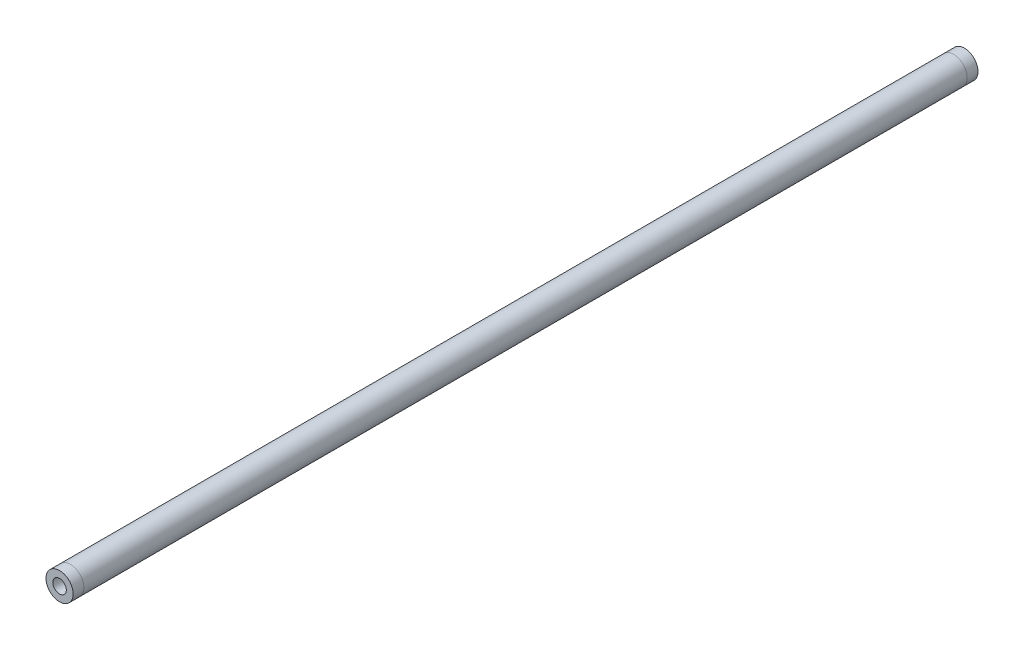
ISO-10303-21;
HEADER;
FILE_DESCRIPTION(('STEP AP214'),'2;1');
FILE_NAME('part.step','',(''),(''),'','','');
FILE_SCHEMA(('AUTOMOTIVE_DESIGN { 1 0 10303 214 1 1 1 1 }'));
ENDSEC;
DATA;
#1=APPLICATION_CONTEXT('core data for automotive mechanical design processes');
#2=APPLICATION_PROTOCOL_DEFINITION('international standard','automotive_design',2000,#1);
#3=PRODUCT_CONTEXT('',#1,'mechanical');
#4=PRODUCT('Part','Part','',(#3));
#5=PRODUCT_RELATED_PRODUCT_CATEGORY('part','',(#4));
#6=PRODUCT_DEFINITION_FORMATION('','',#4);
#7=PRODUCT_DEFINITION_CONTEXT('part definition',#1,'design');
#8=PRODUCT_DEFINITION('design','',#6,#7);
#9=PRODUCT_DEFINITION_SHAPE('','',#8);
#10=(LENGTH_UNIT() NAMED_UNIT(*) SI_UNIT(.MILLI.,.METRE.));
#11=(NAMED_UNIT(*) PLANE_ANGLE_UNIT() SI_UNIT($,.RADIAN.));
#12=(NAMED_UNIT(*) SI_UNIT($,.STERADIAN.) SOLID_ANGLE_UNIT());
#13=UNCERTAINTY_MEASURE_WITH_UNIT(LENGTH_MEASURE(1.E-05),#10,'distance_accuracy_value','');
#14=(GEOMETRIC_REPRESENTATION_CONTEXT(3) GLOBAL_UNCERTAINTY_ASSIGNED_CONTEXT((#13)) GLOBAL_UNIT_ASSIGNED_CONTEXT((#10,
#11,#12)) REPRESENTATION_CONTEXT('',''));
#15=CARTESIAN_POINT('',(0.,0.,0.));
#16=DIRECTION('',(0.,0.,1.));
#17=DIRECTION('',(1.,0.,0.));
#18=AXIS2_PLACEMENT_3D('',#15,#16,#17);
#19=CARTESIAN_POINT('',(0.,0.,-533.036266284947));
#20=DIRECTION('',(0.,0.,1.));
#21=DIRECTION('',(1.,0.,0.));
#22=AXIS2_PLACEMENT_3D('',#19,#20,#21);
#23=CYLINDRICAL_SURFACE('',#22,8.001);
#24=CARTESIAN_POINT('',(0.,0.,-533.036266284947));
#25=DIRECTION('',(0.,0.,1.));
#26=DIRECTION('',(1.,0.,0.));
#27=AXIS2_PLACEMENT_3D('',#24,#25,#26);
#28=CIRCLE('',#27,8.001);
#29=CARTESIAN_POINT('',(8.001,0.,-533.036266284947));
#30=VERTEX_POINT('',#29);
#31=EDGE_CURVE('E87',#30,#30,#28,.T.);
#32=ORIENTED_EDGE('',*,*,#31,.T.);
#33=EDGE_LOOP('',(#32));
#34=FACE_BOUND('',#33,.T.);
#35=CARTESIAN_POINT('',(0.,0.,-526.686266284947));
#36=DIRECTION('',(0.,0.,1.));
#37=DIRECTION('',(1.,0.,0.));
#38=AXIS2_PLACEMENT_3D('',#35,#36,#37);
#39=CIRCLE('',#38,8.001);
#40=CARTESIAN_POINT('',(8.001,0.,-526.686266284947));
#41=VERTEX_POINT('',#40);
#42=EDGE_CURVE('E83',#41,#41,#39,.T.);
#43=ORIENTED_EDGE('',*,*,#42,.F.);
#44=EDGE_LOOP('',(#43));
#45=FACE_BOUND('',#44,.T.);
#46=ADVANCED_FACE('F80',(#34,#45),#23,.T.);
#47=CARTESIAN_POINT('',(0.,0.,-533.036266284947));
#48=DIRECTION('',(0.,0.,1.));
#49=DIRECTION('',(1.,0.,0.));
#50=AXIS2_PLACEMENT_3D('',#47,#48,#49);
#51=PLANE('',#50);
#52=CARTESIAN_POINT('',(0.,0.,-533.036266284947));
#53=DIRECTION('',(0.,0.,1.));
#54=DIRECTION('',(1.,0.,0.));
#55=AXIS2_PLACEMENT_3D('',#52,#53,#54);
#56=CIRCLE('',#55,3.96875);
#57=CARTESIAN_POINT('',(3.96875,0.,-533.036266284947));
#58=VERTEX_POINT('',#57);
#59=EDGE_CURVE('E96',#58,#58,#56,.T.);
#60=ORIENTED_EDGE('',*,*,#59,.T.);
#61=EDGE_LOOP('',(#60));
#62=FACE_BOUND('',#61,.T.);
#63=ORIENTED_EDGE('',*,*,#31,.F.);
#64=EDGE_LOOP('',(#63));
#65=FACE_BOUND('',#64,.T.);
#66=ADVANCED_FACE('F123',(#62,#65),#51,.F.);
#67=CARTESIAN_POINT('',(0.,0.,-526.686266284947));
#68=DIRECTION('',(0.,0.,1.));
#69=DIRECTION('',(1.,0.,0.));
#70=AXIS2_PLACEMENT_3D('',#67,#68,#69);
#71=PLANE('',#70);
#72=CARTESIAN_POINT('',(0.,0.,-526.686266284947));
#73=DIRECTION('',(0.,0.,1.));
#74=DIRECTION('',(1.,0.,0.));
#75=AXIS2_PLACEMENT_3D('',#72,#73,#74);
#76=CIRCLE('',#75,6.477);
#77=CARTESIAN_POINT('',(-6.477,0.,-526.686266284947));
#78=VERTEX_POINT('',#77);
#79=EDGE_CURVE('E12',#78,#78,#76,.T.);
#80=ORIENTED_EDGE('',*,*,#79,.F.);
#81=EDGE_LOOP('',(#80));
#82=FACE_BOUND('',#81,.T.);
#83=ORIENTED_EDGE('',*,*,#42,.T.);
#84=EDGE_LOOP('',(#83));
#85=FACE_BOUND('',#84,.T.);
#86=ADVANCED_FACE('F119',(#82,#85),#71,.T.);
#87=CARTESIAN_POINT('',(0.,0.,-533.036266284947));
#88=DIRECTION('',(0.,0.,1.));
#89=DIRECTION('',(1.,0.,0.));
#90=AXIS2_PLACEMENT_3D('',#87,#88,#89);
#91=CYLINDRICAL_SURFACE('',#90,3.96875);
#92=ORIENTED_EDGE('',*,*,#59,.F.);
#93=EDGE_LOOP('',(#92));
#94=FACE_BOUND('',#93,.T.);
#95=CARTESIAN_POINT('',(0.,0.,-517.161266284947));
#96=DIRECTION('',(0.,0.,1.));
#97=DIRECTION('',(1.,0.,0.));
#98=AXIS2_PLACEMENT_3D('',#95,#96,#97);
#99=CIRCLE('',#98,3.96875);
#100=CARTESIAN_POINT('',(3.96875,0.,-517.161266284947));
#101=VERTEX_POINT('',#100);
#102=EDGE_CURVE('E102',#101,#101,#99,.T.);
#103=ORIENTED_EDGE('',*,*,#102,.T.);
#104=EDGE_LOOP('',(#103));
#105=FACE_BOUND('',#104,.T.);
#106=ADVANCED_FACE('F108',(#94,#105),#91,.F.);
#107=CARTESIAN_POINT('',(0.,0.,-517.161266284947));
#108=DIRECTION('',(0.,0.,1.));
#109=DIRECTION('',(1.,0.,0.));
#110=AXIS2_PLACEMENT_3D('',#107,#108,#109);
#111=PLANE('',#110);
#112=CARTESIAN_POINT('',(0.,0.,-517.161266284947));
#113=DIRECTION('',(0.,0.,1.));
#114=DIRECTION('',(1.,0.,0.));
#115=AXIS2_PLACEMENT_3D('',#112,#113,#114);
#116=CIRCLE('',#115,6.477);
#117=CARTESIAN_POINT('',(-6.477,0.,-517.161266284947));
#118=VERTEX_POINT('',#117);
#119=EDGE_CURVE('E94',#118,#118,#116,.T.);
#120=ORIENTED_EDGE('',*,*,#119,.T.);
#121=EDGE_LOOP('',(#120));
#122=FACE_BOUND('',#121,.T.);
#123=ORIENTED_EDGE('',*,*,#102,.F.);
#124=EDGE_LOOP('',(#123));
#125=FACE_BOUND('',#124,.T.);
#126=ADVANCED_FACE('F110',(#122,#125),#111,.T.);
#127=CARTESIAN_POINT('',(0.,0.,-517.161266284947));
#128=DIRECTION('',(0.,0.,-1.));
#129=DIRECTION('',(-1.,0.,0.));
#130=AXIS2_PLACEMENT_3D('',#127,#128,#129);
#131=CYLINDRICAL_SURFACE('',#130,6.477);
#132=CARTESIAN_POINT('',(-6.477,0.,-517.161266284947));
#133=CARTESIAN_POINT('',(-6.477,0.,-517.260485034947));
#134=CARTESIAN_POINT('',(-6.477,0.,-517.359703784947));
#135=CARTESIAN_POINT('',(-6.477,0.,-517.558141284947));
#136=CARTESIAN_POINT('',(-6.477,0.,-517.657360034947));
#137=CARTESIAN_POINT('',(-6.477,0.,-517.855797534947));
#138=CARTESIAN_POINT('',(-6.477,0.,-517.955016284947));
#139=CARTESIAN_POINT('',(-6.477,0.,-518.153453784947));
#140=CARTESIAN_POINT('',(-6.477,0.,-518.252672534947));
#141=CARTESIAN_POINT('',(-6.477,0.,-518.451110034947));
#142=CARTESIAN_POINT('',(-6.477,0.,-518.550328784947));
#143=CARTESIAN_POINT('',(-6.477,0.,-518.748766284947));
#144=CARTESIAN_POINT('',(-6.477,0.,-518.847985034947));
#145=CARTESIAN_POINT('',(-6.477,0.,-519.046422534947));
#146=CARTESIAN_POINT('',(-6.477,0.,-519.145641284947));
#147=CARTESIAN_POINT('',(-6.477,0.,-519.344078784947));
#148=CARTESIAN_POINT('',(-6.477,0.,-519.443297534947));
#149=CARTESIAN_POINT('',(-6.477,0.,-519.641735034947));
#150=CARTESIAN_POINT('',(-6.477,0.,-519.740953784947));
#151=CARTESIAN_POINT('',(-6.477,0.,-519.939391284947));
#152=CARTESIAN_POINT('',(-6.477,0.,-520.038610034947));
#153=CARTESIAN_POINT('',(-6.477,0.,-520.237047534947));
#154=CARTESIAN_POINT('',(-6.477,0.,-520.336266284947));
#155=CARTESIAN_POINT('',(-6.477,0.,-520.534703784947));
#156=CARTESIAN_POINT('',(-6.477,0.,-520.633922534947));
#157=CARTESIAN_POINT('',(-6.477,0.,-520.832360034947));
#158=CARTESIAN_POINT('',(-6.477,0.,-520.931578784947));
#159=CARTESIAN_POINT('',(-6.477,0.,-521.130016284947));
#160=CARTESIAN_POINT('',(-6.477,0.,-521.229235034947));
#161=CARTESIAN_POINT('',(-6.477,0.,-521.427672534947));
#162=CARTESIAN_POINT('',(-6.477,0.,-521.526891284947));
#163=CARTESIAN_POINT('',(-6.477,0.,-521.725328784947));
#164=CARTESIAN_POINT('',(-6.477,0.,-521.824547534947));
#165=CARTESIAN_POINT('',(-6.477,0.,-522.022985034947));
#166=CARTESIAN_POINT('',(-6.477,0.,-522.122203784947));
#167=CARTESIAN_POINT('',(-6.477,0.,-522.320641284947));
#168=CARTESIAN_POINT('',(-6.477,0.,-522.419860034947));
#169=CARTESIAN_POINT('',(-6.477,0.,-522.618297534947));
#170=CARTESIAN_POINT('',(-6.477,0.,-522.717516284947));
#171=CARTESIAN_POINT('',(-6.477,0.,-522.915953784947));
#172=CARTESIAN_POINT('',(-6.477,0.,-523.015172534947));
#173=CARTESIAN_POINT('',(-6.477,0.,-523.213610034947));
#174=CARTESIAN_POINT('',(-6.477,0.,-523.312828784947));
#175=CARTESIAN_POINT('',(-6.477,0.,-523.511266284947));
#176=CARTESIAN_POINT('',(-6.477,0.,-523.610485034947));
#177=CARTESIAN_POINT('',(-6.477,0.,-523.808922534947));
#178=CARTESIAN_POINT('',(-6.477,0.,-523.908141284947));
#179=CARTESIAN_POINT('',(-6.477,0.,-524.106578784947));
#180=CARTESIAN_POINT('',(-6.477,0.,-524.205797534947));
#181=CARTESIAN_POINT('',(-6.477,0.,-524.404235034947));
#182=CARTESIAN_POINT('',(-6.477,0.,-524.503453784947));
#183=CARTESIAN_POINT('',(-6.477,0.,-524.701891284947));
#184=CARTESIAN_POINT('',(-6.477,0.,-524.801110034947));
#185=CARTESIAN_POINT('',(-6.477,0.,-524.999547534947));
#186=CARTESIAN_POINT('',(-6.477,0.,-525.098766284947));
#187=CARTESIAN_POINT('',(-6.477,0.,-525.297203784947));
#188=CARTESIAN_POINT('',(-6.477,0.,-525.396422534947));
#189=CARTESIAN_POINT('',(-6.477,0.,-525.594860034947));
#190=CARTESIAN_POINT('',(-6.477,0.,-525.694078784947));
#191=CARTESIAN_POINT('',(-6.477,0.,-525.892516284947));
#192=CARTESIAN_POINT('',(-6.477,0.,-525.991735034947));
#193=CARTESIAN_POINT('',(-6.477,0.,-526.190172534947));
#194=CARTESIAN_POINT('',(-6.477,0.,-526.289391284947));
#195=CARTESIAN_POINT('',(-6.477,0.,-526.487828784947));
#196=CARTESIAN_POINT('',(-6.477,0.,-526.587047534947));
#197=CARTESIAN_POINT('',(-6.477,0.,-526.686266284947));
#198=B_SPLINE_CURVE_WITH_KNOTS('',3,(#132,#133,#134,#135,#136,#137,#138,#139,#140,#141,#142,
#143,#144,#145,#146,#147,#148,#149,#150,#151,#152,#153,#154,#155,#156,#157,#158,#159,#160,#161,
#162,#163,#164,#165,#166,#167,#168,#169,#170,#171,#172,#173,#174,#175,#176,#177,#178,#179,#180,
#181,#182,#183,#184,#185,#186,#187,#188,#189,#190,#191,#192,#193,#194,#195,#196,#197),
.UNSPECIFIED.,.F.,.F.,(4,2,2,2,2,2,2,2,2,2,2,2,2,2,2,2,2,2,2,2,2,2,2,2,2,2,2,2,2,2,2,2,4),(0.,
0.297656249999889,0.595312499999889,0.89296874999989,1.19062499999989,1.48828124999989,
1.78593749999989,2.08359374999989,2.38124999999989,2.67890624999989,2.97656249999989,
3.27421874999989,3.57187499999989,3.86953124999989,4.16718749999989,4.46484374999989,
4.76249999999989,5.06015624999989,5.35781249999989,5.65546874999989,5.95312499999989,
6.25078124999989,6.54843749999989,6.84609374999989,7.14374999999989,7.44140624999989,
7.73906249999989,8.03671874999989,8.33437499999989,8.63203124999989,8.92968749999989,
9.22734374999989,9.5249999999999),.UNSPECIFIED.);
#199=EDGE_CURVE('BSEAM112',#118,#78,#198,.T.);
#200=ORIENTED_EDGE('',*,*,#119,.F.);
#201=ORIENTED_EDGE('',*,*,#79,.T.);
#202=ORIENTED_EDGE('',*,*,#199,.T.);
#203=ORIENTED_EDGE('',*,*,#199,.F.);
#204=EDGE_LOOP('',(#200,#202,#201,#203));
#205=FACE_BOUND('',#204,.T.);
#206=ADVANCED_FACE('F112',(#205),#131,.T.);
#207=CLOSED_SHELL('',(#46,#66,#86,#106,#126,#206));
#208=MANIFOLD_SOLID_BREP('B2',#207);
#209=CARTESIAN_POINT('',(0.,0.,-526.686266284947));
#210=DIRECTION('',(0.,0.,1.));
#211=DIRECTION('',(1.,0.,0.));
#212=AXIS2_PLACEMENT_3D('',#209,#210,#211);
#213=CYLINDRICAL_SURFACE('',#212,8.001);
#214=CARTESIAN_POINT('',(0.,0.,-526.686266284947));
#215=DIRECTION('',(0.,0.,1.));
#216=DIRECTION('',(1.,0.,0.));
#217=AXIS2_PLACEMENT_3D('',#214,#215,#216);
#218=CIRCLE('',#217,8.001);
#219=CARTESIAN_POINT('',(8.001,0.,-526.686266284947));
#220=VERTEX_POINT('',#219);
#221=EDGE_CURVE('E79',#220,#220,#218,.T.);
#222=ORIENTED_EDGE('',*,*,#221,.T.);
#223=EDGE_LOOP('',(#222));
#224=FACE_BOUND('',#223,.T.);
#225=CARTESIAN_POINT('',(0.,0.,-6.35));
#226=DIRECTION('',(0.,0.,1.));
#227=DIRECTION('',(1.,0.,0.));
#228=AXIS2_PLACEMENT_3D('',#225,#226,#227);
#229=CIRCLE('',#228,8.001);
#230=CARTESIAN_POINT('',(8.001,0.,-6.35));
#231=VERTEX_POINT('',#230);
#232=EDGE_CURVE('E195',#231,#231,#229,.T.);
#233=ORIENTED_EDGE('',*,*,#232,.F.);
#234=EDGE_LOOP('',(#233));
#235=FACE_BOUND('',#234,.T.);
#236=ADVANCED_FACE('F192',(#224,#235),#213,.T.);
#237=CARTESIAN_POINT('',(0.,0.,-526.686266284947));
#238=DIRECTION('',(0.,0.,1.));
#239=DIRECTION('',(1.,0.,0.));
#240=AXIS2_PLACEMENT_3D('',#237,#238,#239);
#241=PLANE('',#240);
#242=CARTESIAN_POINT('',(0.,0.,-526.686266284947));
#243=DIRECTION('',(0.,0.,1.));
#244=DIRECTION('',(1.,0.,0.));
#245=AXIS2_PLACEMENT_3D('',#242,#243,#244);
#246=CIRCLE('',#245,6.477);
#247=CARTESIAN_POINT('',(6.477,0.,-526.686266284947));
#248=VERTEX_POINT('',#247);
#249=EDGE_CURVE('E204',#248,#248,#246,.T.);
#250=ORIENTED_EDGE('',*,*,#249,.T.);
#251=EDGE_LOOP('',(#250));
#252=FACE_BOUND('',#251,.T.);
#253=ORIENTED_EDGE('',*,*,#221,.F.);
#254=EDGE_LOOP('',(#253));
#255=FACE_BOUND('',#254,.T.);
#256=ADVANCED_FACE('F214',(#252,#255),#241,.F.);
#257=CARTESIAN_POINT('',(0.,0.,-6.35));
#258=DIRECTION('',(0.,0.,1.));
#259=DIRECTION('',(1.,0.,0.));
#260=AXIS2_PLACEMENT_3D('',#257,#258,#259);
#261=PLANE('',#260);
#262=CARTESIAN_POINT('',(0.,0.,-6.35));
#263=DIRECTION('',(0.,0.,1.));
#264=DIRECTION('',(1.,0.,0.));
#265=AXIS2_PLACEMENT_3D('',#262,#263,#264);
#266=CIRCLE('',#265,6.477);
#267=CARTESIAN_POINT('',(6.477,0.,-6.35));
#268=VERTEX_POINT('',#267);
#269=EDGE_CURVE('E206',#268,#268,#266,.T.);
#270=ORIENTED_EDGE('',*,*,#269,.F.);
#271=EDGE_LOOP('',(#270));
#272=FACE_BOUND('',#271,.T.);
#273=ORIENTED_EDGE('',*,*,#232,.T.);
#274=EDGE_LOOP('',(#273));
#275=FACE_BOUND('',#274,.T.);
#276=ADVANCED_FACE('F220',(#272,#275),#261,.T.);
#277=CARTESIAN_POINT('',(0.,0.,-526.686266284947));
#278=DIRECTION('',(0.,0.,1.));
#279=DIRECTION('',(1.,0.,0.));
#280=AXIS2_PLACEMENT_3D('',#277,#278,#279);
#281=CYLINDRICAL_SURFACE('',#280,6.477);
#282=ORIENTED_EDGE('',*,*,#249,.F.);
#283=EDGE_LOOP('',(#282));
#284=FACE_BOUND('',#283,.T.);
#285=ORIENTED_EDGE('',*,*,#269,.T.);
#286=EDGE_LOOP('',(#285));
#287=FACE_BOUND('',#286,.T.);
#288=ADVANCED_FACE('F217',(#284,#287),#281,.F.);
#289=CLOSED_SHELL('',(#236,#256,#276,#288));
#290=MANIFOLD_SOLID_BREP('B7',#289);
#291=CARTESIAN_POINT('',(0.,0.,-6.35));
#292=DIRECTION('',(0.,0.,1.));
#293=DIRECTION('',(1.,0.,0.));
#294=AXIS2_PLACEMENT_3D('',#291,#292,#293);
#295=CYLINDRICAL_SURFACE('',#294,8.001);
#296=CARTESIAN_POINT('',(0.,0.,-6.35));
#297=DIRECTION('',(0.,0.,1.));
#298=DIRECTION('',(1.,0.,0.));
#299=AXIS2_PLACEMENT_3D('',#296,#297,#298);
#300=CIRCLE('',#299,8.001);
#301=CARTESIAN_POINT('',(8.001,0.,-6.35));
#302=VERTEX_POINT('',#301);
#303=EDGE_CURVE('E191',#302,#302,#300,.T.);
#304=ORIENTED_EDGE('',*,*,#303,.T.);
#305=EDGE_LOOP('',(#304));
#306=FACE_BOUND('',#305,.T.);
#307=CARTESIAN_POINT('',(0.,0.,0.));
#308=DIRECTION('',(0.,0.,1.));
#309=DIRECTION('',(1.,0.,0.));
#310=AXIS2_PLACEMENT_3D('',#307,#308,#309);
#311=CIRCLE('',#310,8.001);
#312=CARTESIAN_POINT('',(8.001,0.,0.));
#313=VERTEX_POINT('',#312);
#314=EDGE_CURVE('E269',#313,#313,#311,.T.);
#315=ORIENTED_EDGE('',*,*,#314,.F.);
#316=EDGE_LOOP('',(#315));
#317=FACE_BOUND('',#316,.T.);
#318=ADVANCED_FACE('F258',(#306,#317),#295,.T.);
#319=CARTESIAN_POINT('',(0.,0.,-6.35));
#320=DIRECTION('',(0.,0.,1.));
#321=DIRECTION('',(1.,0.,0.));
#322=AXIS2_PLACEMENT_3D('',#319,#320,#321);
#323=CYLINDRICAL_SURFACE('',#322,3.96875);
#324=CARTESIAN_POINT('',(0.,0.,0.));
#325=DIRECTION('',(0.,0.,1.));
#326=DIRECTION('',(1.,0.,0.));
#327=AXIS2_PLACEMENT_3D('',#324,#325,#326);
#328=CIRCLE('',#327,3.96875);
#329=CARTESIAN_POINT('',(3.96875,0.,0.));
#330=VERTEX_POINT('',#329);
#331=EDGE_CURVE('E261',#330,#330,#328,.T.);
#332=ORIENTED_EDGE('',*,*,#331,.T.);
#333=EDGE_LOOP('',(#332));
#334=FACE_BOUND('',#333,.T.);
#335=CARTESIAN_POINT('',(0.,0.,-15.875));
#336=DIRECTION('',(0.,0.,1.));
#337=DIRECTION('',(1.,0.,0.));
#338=AXIS2_PLACEMENT_3D('',#335,#336,#337);
#339=CIRCLE('',#338,3.96875);
#340=CARTESIAN_POINT('',(3.96875,0.,-15.875));
#341=VERTEX_POINT('',#340);
#342=EDGE_CURVE('E281',#341,#341,#339,.T.);
#343=ORIENTED_EDGE('',*,*,#342,.F.);
#344=EDGE_LOOP('',(#343));
#345=FACE_BOUND('',#344,.T.);
#346=ADVANCED_FACE('F289',(#334,#345),#323,.F.);
#347=CARTESIAN_POINT('',(0.,0.,-6.35));
#348=DIRECTION('',(0.,0.,1.));
#349=DIRECTION('',(1.,0.,0.));
#350=AXIS2_PLACEMENT_3D('',#347,#348,#349);
#351=PLANE('',#350);
#352=CARTESIAN_POINT('',(0.,0.,-6.35));
#353=DIRECTION('',(0.,0.,1.));
#354=DIRECTION('',(1.,0.,0.));
#355=AXIS2_PLACEMENT_3D('',#352,#353,#354);
#356=CIRCLE('',#355,6.477);
#357=CARTESIAN_POINT('',(6.477,0.,-6.35));
#358=VERTEX_POINT('',#357);
#359=EDGE_CURVE('E271',#358,#358,#356,.T.);
#360=ORIENTED_EDGE('',*,*,#359,.T.);
#361=EDGE_LOOP('',(#360));
#362=FACE_BOUND('',#361,.T.);
#363=ORIENTED_EDGE('',*,*,#303,.F.);
#364=EDGE_LOOP('',(#363));
#365=FACE_BOUND('',#364,.T.);
#366=ADVANCED_FACE('F291',(#362,#365),#351,.F.);
#367=CARTESIAN_POINT('',(0.,0.,0.));
#368=DIRECTION('',(0.,0.,1.));
#369=DIRECTION('',(1.,0.,0.));
#370=AXIS2_PLACEMENT_3D('',#367,#368,#369);
#371=PLANE('',#370);
#372=ORIENTED_EDGE('',*,*,#314,.T.);
#373=EDGE_LOOP('',(#372));
#374=FACE_BOUND('',#373,.T.);
#375=ORIENTED_EDGE('',*,*,#331,.F.);
#376=EDGE_LOOP('',(#375));
#377=FACE_BOUND('',#376,.T.);
#378=ADVANCED_FACE('F297',(#374,#377),#371,.T.);
#379=CARTESIAN_POINT('',(0.,0.,-15.875));
#380=DIRECTION('',(0.,0.,1.));
#381=DIRECTION('',(1.,0.,0.));
#382=AXIS2_PLACEMENT_3D('',#379,#380,#381);
#383=CYLINDRICAL_SURFACE('',#382,6.477);
#384=CARTESIAN_POINT('',(0.,0.,-15.875));
#385=DIRECTION('',(0.,0.,1.));
#386=DIRECTION('',(1.,0.,0.));
#387=AXIS2_PLACEMENT_3D('',#384,#385,#386);
#388=CIRCLE('',#387,6.477);
#389=CARTESIAN_POINT('',(6.477,0.,-15.875));
#390=VERTEX_POINT('',#389);
#391=EDGE_CURVE('E274',#390,#390,#388,.T.);
#392=CARTESIAN_POINT('',(6.477,0.,-15.875));
#393=CARTESIAN_POINT('',(6.477,0.,-15.77578125));
#394=CARTESIAN_POINT('',(6.477,0.,-15.6765625));
#395=CARTESIAN_POINT('',(6.477,0.,-15.478125));
#396=CARTESIAN_POINT('',(6.477,0.,-15.37890625));
#397=CARTESIAN_POINT('',(6.477,0.,-15.18046875));
#398=CARTESIAN_POINT('',(6.477,0.,-15.08125));
#399=CARTESIAN_POINT('',(6.477,0.,-14.8828125));
#400=CARTESIAN_POINT('',(6.477,0.,-14.78359375));
#401=CARTESIAN_POINT('',(6.477,0.,-14.58515625));
#402=CARTESIAN_POINT('',(6.477,0.,-14.4859375));
#403=CARTESIAN_POINT('',(6.477,0.,-14.2875));
#404=CARTESIAN_POINT('',(6.477,0.,-14.18828125));
#405=CARTESIAN_POINT('',(6.477,0.,-13.98984375));
#406=CARTESIAN_POINT('',(6.477,0.,-13.890625));
#407=CARTESIAN_POINT('',(6.477,0.,-13.6921875));
#408=CARTESIAN_POINT('',(6.477,0.,-13.59296875));
#409=CARTESIAN_POINT('',(6.477,0.,-13.39453125));
#410=CARTESIAN_POINT('',(6.477,0.,-13.2953125));
#411=CARTESIAN_POINT('',(6.477,0.,-13.096875));
#412=CARTESIAN_POINT('',(6.477,0.,-12.99765625));
#413=CARTESIAN_POINT('',(6.477,0.,-12.79921875));
#414=CARTESIAN_POINT('',(6.477,0.,-12.7));
#415=CARTESIAN_POINT('',(6.477,0.,-12.5015625));
#416=CARTESIAN_POINT('',(6.477,0.,-12.40234375));
#417=CARTESIAN_POINT('',(6.477,0.,-12.20390625));
#418=CARTESIAN_POINT('',(6.477,0.,-12.1046875));
#419=CARTESIAN_POINT('',(6.477,0.,-11.90625));
#420=CARTESIAN_POINT('',(6.477,0.,-11.80703125));
#421=CARTESIAN_POINT('',(6.477,0.,-11.60859375));
#422=CARTESIAN_POINT('',(6.477,0.,-11.509375));
#423=CARTESIAN_POINT('',(6.477,0.,-11.3109375));
#424=CARTESIAN_POINT('',(6.477,0.,-11.21171875));
#425=CARTESIAN_POINT('',(6.477,0.,-11.01328125));
#426=CARTESIAN_POINT('',(6.477,0.,-10.9140625));
#427=CARTESIAN_POINT('',(6.477,0.,-10.715625));
#428=CARTESIAN_POINT('',(6.477,0.,-10.61640625));
#429=CARTESIAN_POINT('',(6.477,0.,-10.41796875));
#430=CARTESIAN_POINT('',(6.477,0.,-10.31875));
#431=CARTESIAN_POINT('',(6.477,0.,-10.1203125));
#432=CARTESIAN_POINT('',(6.477,0.,-10.02109375));
#433=CARTESIAN_POINT('',(6.477,0.,-9.82265625));
#434=CARTESIAN_POINT('',(6.477,0.,-9.7234375));
#435=CARTESIAN_POINT('',(6.477,0.,-9.525));
#436=CARTESIAN_POINT('',(6.477,0.,-9.42578125));
#437=CARTESIAN_POINT('',(6.477,0.,-9.22734375));
#438=CARTESIAN_POINT('',(6.477,0.,-9.128125));
#439=CARTESIAN_POINT('',(6.477,0.,-8.9296875));
#440=CARTESIAN_POINT('',(6.477,0.,-8.83046875));
#441=CARTESIAN_POINT('',(6.477,0.,-8.63203125));
#442=CARTESIAN_POINT('',(6.477,0.,-8.5328125));
#443=CARTESIAN_POINT('',(6.477,0.,-8.334375));
#444=CARTESIAN_POINT('',(6.477,0.,-8.23515625));
#445=CARTESIAN_POINT('',(6.477,0.,-8.03671875));
#446=CARTESIAN_POINT('',(6.477,0.,-7.9375));
#447=CARTESIAN_POINT('',(6.477,0.,-7.7390625));
#448=CARTESIAN_POINT('',(6.477,0.,-7.63984375));
#449=CARTESIAN_POINT('',(6.477,0.,-7.44140625));
#450=CARTESIAN_POINT('',(6.477,0.,-7.3421875));
#451=CARTESIAN_POINT('',(6.477,0.,-7.14375));
#452=CARTESIAN_POINT('',(6.477,0.,-7.04453125));
#453=CARTESIAN_POINT('',(6.477,0.,-6.84609375));
#454=CARTESIAN_POINT('',(6.477,0.,-6.746875));
#455=CARTESIAN_POINT('',(6.477,0.,-6.5484375));
#456=CARTESIAN_POINT('',(6.477,0.,-6.44921875));
#457=CARTESIAN_POINT('',(6.477,0.,-6.35));
#458=B_SPLINE_CURVE_WITH_KNOTS('',3,(#392,#393,#394,#395,#396,#397,#398,#399,#400,#401,#402,
#403,#404,#405,#406,#407,#408,#409,#410,#411,#412,#413,#414,#415,#416,#417,#418,#419,#420,#421,
#422,#423,#424,#425,#426,#427,#428,#429,#430,#431,#432,#433,#434,#435,#436,#437,#438,#439,#440,
#441,#442,#443,#444,#445,#446,#447,#448,#449,#450,#451,#452,#453,#454,#455,#456,#457),
.UNSPECIFIED.,.F.,.F.,(4,2,2,2,2,2,2,2,2,2,2,2,2,2,2,2,2,2,2,2,2,2,2,2,2,2,2,2,2,2,2,2,4),(0.,
0.297656250000002,0.595312500000002,0.892968750000002,1.190625,1.48828125,1.7859375,2.08359375,
2.38125,2.67890625,2.9765625,3.27421875,3.571875,3.86953125,4.1671875,4.46484375,4.7625,
5.06015625,5.3578125,5.65546875,5.953125,6.25078125,6.5484375,6.84609375,7.14375,7.44140625,
7.7390625,8.03671875,8.334375,8.63203125,8.9296875,9.22734375,9.525),.UNSPECIFIED.);
#459=EDGE_CURVE('BSEAM302',#390,#358,#458,.T.);
#460=ORIENTED_EDGE('',*,*,#391,.T.);
#461=ORIENTED_EDGE('',*,*,#359,.F.);
#462=ORIENTED_EDGE('',*,*,#459,.T.);
#463=ORIENTED_EDGE('',*,*,#459,.F.);
#464=EDGE_LOOP('',(#460,#462,#461,#463));
#465=FACE_BOUND('',#464,.T.);
#466=ADVANCED_FACE('F302',(#465),#383,.T.);
#467=CARTESIAN_POINT('',(0.,0.,-15.875));
#468=DIRECTION('',(0.,0.,1.));
#469=DIRECTION('',(1.,0.,0.));
#470=AXIS2_PLACEMENT_3D('',#467,#468,#469);
#471=PLANE('',#470);
#472=ORIENTED_EDGE('',*,*,#342,.T.);
#473=EDGE_LOOP('',(#472));
#474=FACE_BOUND('',#473,.T.);
#475=ORIENTED_EDGE('',*,*,#391,.F.);
#476=EDGE_LOOP('',(#475));
#477=FACE_BOUND('',#476,.T.);
#478=ADVANCED_FACE('F286',(#474,#477),#471,.F.);
#479=CLOSED_SHELL('',(#318,#346,#366,#378,#466,#478));
#480=MANIFOLD_SOLID_BREP('B74',#479);
#481=ADVANCED_BREP_SHAPE_REPRESENTATION('',(#18,#208,#290,#480),#14);
#482=SHAPE_DEFINITION_REPRESENTATION(#9,#481);
ENDSEC;
END-ISO-10303-21;
